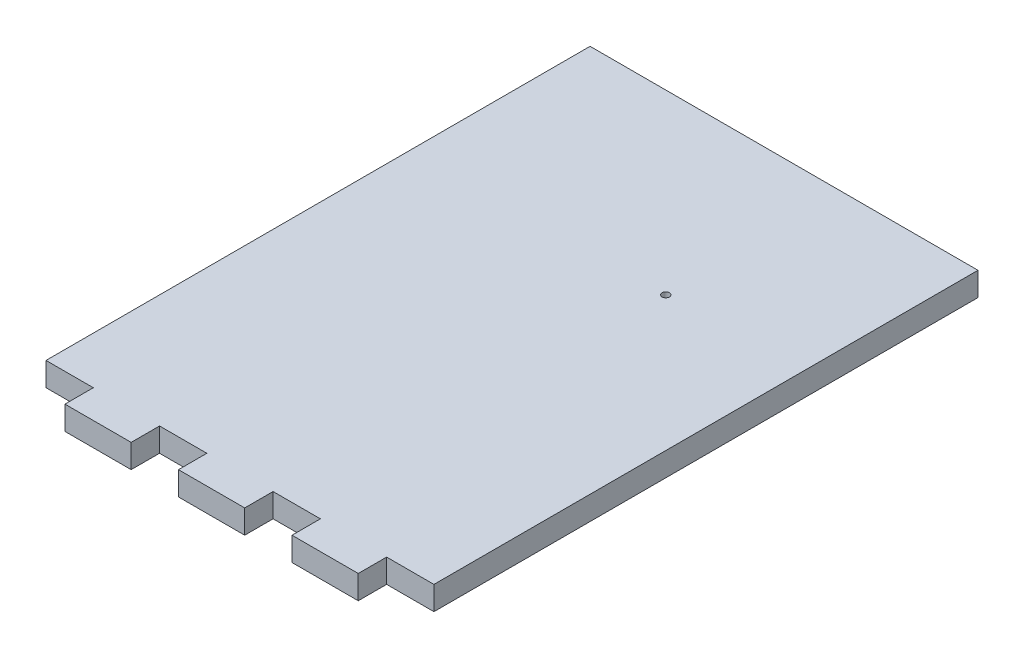
ISO-10303-21;
HEADER;
FILE_DESCRIPTION(('STEP AP214'),'2;1');
FILE_NAME('part.step','',(''),(''),'','','');
FILE_SCHEMA(('AUTOMOTIVE_DESIGN { 1 0 10303 214 1 1 1 1 }'));
ENDSEC;
DATA;
#1=APPLICATION_CONTEXT('core data for automotive mechanical design processes');
#2=APPLICATION_PROTOCOL_DEFINITION('international standard','automotive_design',2000,#1);
#3=PRODUCT_CONTEXT('',#1,'mechanical');
#4=PRODUCT('Part','Part','',(#3));
#5=PRODUCT_RELATED_PRODUCT_CATEGORY('part','',(#4));
#6=PRODUCT_DEFINITION_FORMATION('','',#4);
#7=PRODUCT_DEFINITION_CONTEXT('part definition',#1,'design');
#8=PRODUCT_DEFINITION('design','',#6,#7);
#9=PRODUCT_DEFINITION_SHAPE('','',#8);
#10=(LENGTH_UNIT() NAMED_UNIT(*) SI_UNIT(.MILLI.,.METRE.));
#11=(NAMED_UNIT(*) PLANE_ANGLE_UNIT() SI_UNIT($,.RADIAN.));
#12=(NAMED_UNIT(*) SI_UNIT($,.STERADIAN.) SOLID_ANGLE_UNIT());
#13=UNCERTAINTY_MEASURE_WITH_UNIT(LENGTH_MEASURE(1.E-05),#10,'distance_accuracy_value','');
#14=(GEOMETRIC_REPRESENTATION_CONTEXT(3) GLOBAL_UNCERTAINTY_ASSIGNED_CONTEXT((#13)) GLOBAL_UNIT_ASSIGNED_CONTEXT((#10,
#11,#12)) REPRESENTATION_CONTEXT('',''));
#15=CARTESIAN_POINT('',(0.,0.,0.));
#16=DIRECTION('',(0.,0.,1.));
#17=DIRECTION('',(1.,0.,0.));
#18=AXIS2_PLACEMENT_3D('',#15,#16,#17);
#19=CARTESIAN_POINT('',(0.,0.,0.));
#20=DIRECTION('',(0.,1.,0.));
#21=DIRECTION('',(0.,0.,1.));
#22=AXIS2_PLACEMENT_3D('',#19,#20,#21);
#23=PLANE('',#22);
#24=CARTESIAN_POINT('',(102.,0.,-190.));
#25=DIRECTION('',(0.,1.,0.));
#26=DIRECTION('',(0.,0.,1.));
#27=AXIS2_PLACEMENT_3D('',#24,#25,#26);
#28=CIRCLE('',#27,3.89999999999998);
#29=CARTESIAN_POINT('',(102.,0.,-186.1));
#30=VERTEX_POINT('',#29);
#31=EDGE_CURVE('E347',#30,#30,#28,.T.);
#32=ORIENTED_EDGE('',*,*,#31,.T.);
#33=EDGE_LOOP('',(#32));
#34=FACE_BOUND('',#33,.T.);
#35=DIRECTION('',(-1.,0.,0.));
#36=VECTOR('',#35,1.);
#37=CARTESIAN_POINT('',(164.,0.,-230.));
#38=LINE('',#37,#36);
#39=CARTESIAN_POINT('',(164.,0.,-230.));
#40=VERTEX_POINT('',#39);
#41=CARTESIAN_POINT('',(0.,0.,-230.));
#42=VERTEX_POINT('',#41);
#43=EDGE_CURVE('E181',#40,#42,#38,.T.);
#44=ORIENTED_EDGE('',*,*,#43,.F.);
#45=DIRECTION('',(0.,0.,1.));
#46=VECTOR('',#45,1.);
#47=CARTESIAN_POINT('',(164.,0.,-230.));
#48=LINE('',#47,#46);
#49=CARTESIAN_POINT('',(164.,0.,0.));
#50=VERTEX_POINT('',#49);
#51=EDGE_CURVE('E216',#40,#50,#48,.T.);
#52=ORIENTED_EDGE('',*,*,#51,.T.);
#53=DIRECTION('',(1.,0.,0.));
#54=VECTOR('',#53,1.);
#55=CARTESIAN_POINT('',(144.,0.,0.));
#56=LINE('',#55,#54);
#57=CARTESIAN_POINT('',(144.,0.,0.));
#58=VERTEX_POINT('',#57);
#59=EDGE_CURVE('E214',#58,#50,#56,.T.);
#60=ORIENTED_EDGE('',*,*,#59,.F.);
#61=DIRECTION('',(0.,0.,1.));
#62=VECTOR('',#61,1.);
#63=CARTESIAN_POINT('',(144.,0.,0.));
#64=LINE('',#63,#62);
#65=CARTESIAN_POINT('',(144.,0.,12.));
#66=VERTEX_POINT('',#65);
#67=EDGE_CURVE('E159',#58,#66,#64,.T.);
#68=ORIENTED_EDGE('',*,*,#67,.T.);
#69=DIRECTION('',(1.,0.,0.));
#70=VECTOR('',#69,1.);
#71=CARTESIAN_POINT('',(116.,0.,12.));
#72=LINE('',#71,#70);
#73=CARTESIAN_POINT('',(116.,0.,12.));
#74=VERTEX_POINT('',#73);
#75=EDGE_CURVE('E210',#74,#66,#72,.T.);
#76=ORIENTED_EDGE('',*,*,#75,.F.);
#77=DIRECTION('',(0.,0.,1.));
#78=VECTOR('',#77,1.);
#79=CARTESIAN_POINT('',(116.,0.,0.));
#80=LINE('',#79,#78);
#81=CARTESIAN_POINT('',(116.,0.,0.));
#82=VERTEX_POINT('',#81);
#83=EDGE_CURVE('E208',#82,#74,#80,.T.);
#84=ORIENTED_EDGE('',*,*,#83,.F.);
#85=DIRECTION('',(1.,0.,0.));
#86=VECTOR('',#85,1.);
#87=CARTESIAN_POINT('',(96.,0.,0.));
#88=LINE('',#87,#86);
#89=CARTESIAN_POINT('',(96.,0.,0.));
#90=VERTEX_POINT('',#89);
#91=EDGE_CURVE('E206',#90,#82,#88,.T.);
#92=ORIENTED_EDGE('',*,*,#91,.F.);
#93=DIRECTION('',(0.,0.,1.));
#94=VECTOR('',#93,1.);
#95=CARTESIAN_POINT('',(96.,0.,0.));
#96=LINE('',#95,#94);
#97=CARTESIAN_POINT('',(96.,0.,12.));
#98=VERTEX_POINT('',#97);
#99=EDGE_CURVE('E203',#90,#98,#96,.T.);
#100=ORIENTED_EDGE('',*,*,#99,.T.);
#101=DIRECTION('',(1.,0.,0.));
#102=VECTOR('',#101,1.);
#103=CARTESIAN_POINT('',(68.,0.,12.));
#104=LINE('',#103,#102);
#105=CARTESIAN_POINT('',(68.,0.,12.));
#106=VERTEX_POINT('',#105);
#107=EDGE_CURVE('E200',#106,#98,#104,.T.);
#108=ORIENTED_EDGE('',*,*,#107,.F.);
#109=DIRECTION('',(0.,0.,1.));
#110=VECTOR('',#109,1.);
#111=CARTESIAN_POINT('',(68.,0.,0.));
#112=LINE('',#111,#110);
#113=CARTESIAN_POINT('',(68.,0.,0.));
#114=VERTEX_POINT('',#113);
#115=EDGE_CURVE('E198',#114,#106,#112,.T.);
#116=ORIENTED_EDGE('',*,*,#115,.F.);
#117=DIRECTION('',(1.,0.,0.));
#118=VECTOR('',#117,1.);
#119=CARTESIAN_POINT('',(48.,0.,0.));
#120=LINE('',#119,#118);
#121=CARTESIAN_POINT('',(48.,0.,0.));
#122=VERTEX_POINT('',#121);
#123=EDGE_CURVE('E196',#122,#114,#120,.T.);
#124=ORIENTED_EDGE('',*,*,#123,.F.);
#125=DIRECTION('',(0.,0.,1.));
#126=VECTOR('',#125,1.);
#127=CARTESIAN_POINT('',(48.,0.,0.));
#128=LINE('',#127,#126);
#129=CARTESIAN_POINT('',(48.,0.,12.));
#130=VERTEX_POINT('',#129);
#131=EDGE_CURVE('E193',#122,#130,#128,.T.);
#132=ORIENTED_EDGE('',*,*,#131,.T.);
#133=DIRECTION('',(1.,0.,0.));
#134=VECTOR('',#133,1.);
#135=CARTESIAN_POINT('',(20.,0.,12.));
#136=LINE('',#135,#134);
#137=CARTESIAN_POINT('',(20.,0.,12.));
#138=VERTEX_POINT('',#137);
#139=EDGE_CURVE('E190',#138,#130,#136,.T.);
#140=ORIENTED_EDGE('',*,*,#139,.F.);
#141=DIRECTION('',(0.,0.,1.));
#142=VECTOR('',#141,1.);
#143=CARTESIAN_POINT('',(20.,0.,0.));
#144=LINE('',#143,#142);
#145=CARTESIAN_POINT('',(20.,0.,0.));
#146=VERTEX_POINT('',#145);
#147=EDGE_CURVE('E188',#146,#138,#144,.T.);
#148=ORIENTED_EDGE('',*,*,#147,.F.);
#149=DIRECTION('',(1.,0.,0.));
#150=VECTOR('',#149,1.);
#151=CARTESIAN_POINT('',(0.,0.,0.));
#152=LINE('',#151,#150);
#153=CARTESIAN_POINT('',(0.,0.,0.));
#154=VERTEX_POINT('',#153);
#155=EDGE_CURVE('E186',#154,#146,#152,.T.);
#156=ORIENTED_EDGE('',*,*,#155,.F.);
#157=DIRECTION('',(0.,0.,1.));
#158=VECTOR('',#157,1.);
#159=CARTESIAN_POINT('',(0.,0.,-230.));
#160=LINE('',#159,#158);
#161=EDGE_CURVE('E183',#42,#154,#160,.T.);
#162=ORIENTED_EDGE('',*,*,#161,.F.);
#163=EDGE_LOOP('',(#44,#52,#60,#68,#76,#84,#92,#100,#108,#116,#124,#132,#140,#148,#156,#162));
#164=FACE_BOUND('',#163,.T.);
#165=CARTESIAN_POINT('',(62.,0.,-190.));
#166=DIRECTION('',(0.,1.,0.));
#167=DIRECTION('',(0.,0.,1.));
#168=AXIS2_PLACEMENT_3D('',#165,#166,#167);
#169=CIRCLE('',#168,3.89999999999997);
#170=CARTESIAN_POINT('',(62.,0.,-186.1));
#171=VERTEX_POINT('',#170);
#172=EDGE_CURVE('E349',#171,#171,#169,.T.);
#173=ORIENTED_EDGE('',*,*,#172,.T.);
#174=EDGE_LOOP('',(#173));
#175=FACE_BOUND('',#174,.T.);
#176=CARTESIAN_POINT('',(107.,0.,-155.));
#177=DIRECTION('',(0.,1.,0.));
#178=DIRECTION('',(0.,0.,1.));
#179=AXIS2_PLACEMENT_3D('',#176,#177,#178);
#180=CIRCLE('',#179,1.54999999999999);
#181=CARTESIAN_POINT('',(107.,0.,-153.45));
#182=VERTEX_POINT('',#181);
#183=EDGE_CURVE('E341',#182,#182,#180,.T.);
#184=ORIENTED_EDGE('',*,*,#183,.T.);
#185=EDGE_LOOP('',(#184));
#186=FACE_BOUND('',#185,.T.);
#187=ADVANCED_FACE('F33',(#34,#164,#175,#186),#23,.F.);
#188=CARTESIAN_POINT('',(0.,10.,0.));
#189=DIRECTION('',(0.,1.,0.));
#190=DIRECTION('',(0.,0.,1.));
#191=AXIS2_PLACEMENT_3D('',#188,#189,#190);
#192=PLANE('',#191);
#193=DIRECTION('',(-1.,0.,0.));
#194=VECTOR('',#193,1.);
#195=CARTESIAN_POINT('',(164.,10.,-230.));
#196=LINE('',#195,#194);
#197=CARTESIAN_POINT('',(164.,10.,-230.));
#198=VERTEX_POINT('',#197);
#199=CARTESIAN_POINT('',(0.,10.,-230.));
#200=VERTEX_POINT('',#199);
#201=EDGE_CURVE('E219',#198,#200,#196,.T.);
#202=ORIENTED_EDGE('',*,*,#201,.T.);
#203=DIRECTION('',(0.,0.,1.));
#204=VECTOR('',#203,1.);
#205=CARTESIAN_POINT('',(0.,10.,-230.));
#206=LINE('',#205,#204);
#207=CARTESIAN_POINT('',(0.,10.,0.));
#208=VERTEX_POINT('',#207);
#209=EDGE_CURVE('E113',#200,#208,#206,.T.);
#210=ORIENTED_EDGE('',*,*,#209,.T.);
#211=DIRECTION('',(1.,0.,0.));
#212=VECTOR('',#211,1.);
#213=CARTESIAN_POINT('',(0.,10.,0.));
#214=LINE('',#213,#212);
#215=CARTESIAN_POINT('',(20.,10.,0.));
#216=VERTEX_POINT('',#215);
#217=EDGE_CURVE('E254',#208,#216,#214,.T.);
#218=ORIENTED_EDGE('',*,*,#217,.T.);
#219=DIRECTION('',(0.,0.,1.));
#220=VECTOR('',#219,1.);
#221=CARTESIAN_POINT('',(20.,10.,0.));
#222=LINE('',#221,#220);
#223=CARTESIAN_POINT('',(20.,10.,12.));
#224=VERTEX_POINT('',#223);
#225=EDGE_CURVE('E271',#216,#224,#222,.T.);
#226=ORIENTED_EDGE('',*,*,#225,.T.);
#227=DIRECTION('',(1.,0.,0.));
#228=VECTOR('',#227,1.);
#229=CARTESIAN_POINT('',(20.,10.,12.));
#230=LINE('',#229,#228);
#231=CARTESIAN_POINT('',(48.,10.,12.));
#232=VERTEX_POINT('',#231);
#233=EDGE_CURVE('E267',#224,#232,#230,.T.);
#234=ORIENTED_EDGE('',*,*,#233,.T.);
#235=DIRECTION('',(0.,0.,1.));
#236=VECTOR('',#235,1.);
#237=CARTESIAN_POINT('',(48.,10.,0.));
#238=LINE('',#237,#236);
#239=CARTESIAN_POINT('',(48.,10.,0.));
#240=VERTEX_POINT('',#239);
#241=EDGE_CURVE('E270',#240,#232,#238,.T.);
#242=ORIENTED_EDGE('',*,*,#241,.F.);
#243=DIRECTION('',(1.,0.,0.));
#244=VECTOR('',#243,1.);
#245=CARTESIAN_POINT('',(48.,10.,0.));
#246=LINE('',#245,#244);
#247=CARTESIAN_POINT('',(68.,10.,0.));
#248=VERTEX_POINT('',#247);
#249=EDGE_CURVE('E273',#240,#248,#246,.T.);
#250=ORIENTED_EDGE('',*,*,#249,.T.);
#251=DIRECTION('',(0.,0.,1.));
#252=VECTOR('',#251,1.);
#253=CARTESIAN_POINT('',(68.,10.,0.));
#254=LINE('',#253,#252);
#255=CARTESIAN_POINT('',(68.,10.,12.));
#256=VERTEX_POINT('',#255);
#257=EDGE_CURVE('E279',#248,#256,#254,.T.);
#258=ORIENTED_EDGE('',*,*,#257,.T.);
#259=DIRECTION('',(1.,0.,0.));
#260=VECTOR('',#259,1.);
#261=CARTESIAN_POINT('',(68.,10.,12.));
#262=LINE('',#261,#260);
#263=CARTESIAN_POINT('',(96.,10.,12.));
#264=VERTEX_POINT('',#263);
#265=EDGE_CURVE('E281',#256,#264,#262,.T.);
#266=ORIENTED_EDGE('',*,*,#265,.T.);
#267=DIRECTION('',(0.,0.,1.));
#268=VECTOR('',#267,1.);
#269=CARTESIAN_POINT('',(96.,10.,0.));
#270=LINE('',#269,#268);
#271=CARTESIAN_POINT('',(96.,10.,0.));
#272=VERTEX_POINT('',#271);
#273=EDGE_CURVE('E283',#272,#264,#270,.T.);
#274=ORIENTED_EDGE('',*,*,#273,.F.);
#275=DIRECTION('',(1.,0.,0.));
#276=VECTOR('',#275,1.);
#277=CARTESIAN_POINT('',(96.,10.,0.));
#278=LINE('',#277,#276);
#279=CARTESIAN_POINT('',(116.,10.,0.));
#280=VERTEX_POINT('',#279);
#281=EDGE_CURVE('E286',#272,#280,#278,.T.);
#282=ORIENTED_EDGE('',*,*,#281,.T.);
#283=DIRECTION('',(0.,0.,1.));
#284=VECTOR('',#283,1.);
#285=CARTESIAN_POINT('',(116.,10.,0.));
#286=LINE('',#285,#284);
#287=CARTESIAN_POINT('',(116.,10.,12.));
#288=VERTEX_POINT('',#287);
#289=EDGE_CURVE('E176',#280,#288,#286,.T.);
#290=ORIENTED_EDGE('',*,*,#289,.T.);
#291=DIRECTION('',(1.,0.,0.));
#292=VECTOR('',#291,1.);
#293=CARTESIAN_POINT('',(116.,10.,12.));
#294=LINE('',#293,#292);
#295=CARTESIAN_POINT('',(144.,10.,12.));
#296=VERTEX_POINT('',#295);
#297=EDGE_CURVE('E173',#288,#296,#294,.T.);
#298=ORIENTED_EDGE('',*,*,#297,.T.);
#299=DIRECTION('',(0.,0.,1.));
#300=VECTOR('',#299,1.);
#301=CARTESIAN_POINT('',(144.,10.,0.));
#302=LINE('',#301,#300);
#303=CARTESIAN_POINT('',(144.,10.,0.));
#304=VERTEX_POINT('',#303);
#305=EDGE_CURVE('E157',#304,#296,#302,.T.);
#306=ORIENTED_EDGE('',*,*,#305,.F.);
#307=DIRECTION('',(1.,0.,0.));
#308=VECTOR('',#307,1.);
#309=CARTESIAN_POINT('',(144.,10.,0.));
#310=LINE('',#309,#308);
#311=CARTESIAN_POINT('',(164.,10.,0.));
#312=VERTEX_POINT('',#311);
#313=EDGE_CURVE('E164',#304,#312,#310,.T.);
#314=ORIENTED_EDGE('',*,*,#313,.T.);
#315=DIRECTION('',(0.,0.,1.));
#316=VECTOR('',#315,1.);
#317=CARTESIAN_POINT('',(164.,10.,-230.));
#318=LINE('',#317,#316);
#319=EDGE_CURVE('E168',#198,#312,#318,.T.);
#320=ORIENTED_EDGE('',*,*,#319,.F.);
#321=EDGE_LOOP('',(#202,#210,#218,#226,#234,#242,#250,#258,#266,#274,#282,#290,#298,#306,#314,#320));
#322=FACE_BOUND('',#321,.T.);
#323=CARTESIAN_POINT('',(107.,10.,-155.));
#324=DIRECTION('',(0.,1.,0.));
#325=DIRECTION('',(0.,0.,1.));
#326=AXIS2_PLACEMENT_3D('',#323,#324,#325);
#327=CIRCLE('',#326,1.54999999999999);
#328=CARTESIAN_POINT('',(107.,10.,-153.45));
#329=VERTEX_POINT('',#328);
#330=EDGE_CURVE('E338',#329,#329,#327,.T.);
#331=ORIENTED_EDGE('',*,*,#330,.F.);
#332=EDGE_LOOP('',(#331));
#333=FACE_BOUND('',#332,.T.);
#334=ADVANCED_FACE('F170',(#322,#333),#192,.T.);
#335=CARTESIAN_POINT('',(164.,10.,-230.));
#336=DIRECTION('',(0.,0.,1.));
#337=DIRECTION('',(1.,0.,0.));
#338=AXIS2_PLACEMENT_3D('',#335,#336,#337);
#339=PLANE('',#338);
#340=ORIENTED_EDGE('',*,*,#43,.T.);
#341=DIRECTION('',(0.,-1.,0.));
#342=VECTOR('',#341,1.);
#343=CARTESIAN_POINT('',(0.,10.,-230.));
#344=LINE('',#343,#342);
#345=EDGE_CURVE('E11',#200,#42,#344,.T.);
#346=ORIENTED_EDGE('',*,*,#345,.F.);
#347=ORIENTED_EDGE('',*,*,#201,.F.);
#348=DIRECTION('',(0.,-1.,0.));
#349=VECTOR('',#348,1.);
#350=CARTESIAN_POINT('',(164.,10.,-230.));
#351=LINE('',#350,#349);
#352=EDGE_CURVE('E50',#198,#40,#351,.T.);
#353=ORIENTED_EDGE('',*,*,#352,.T.);
#354=EDGE_LOOP('',(#340,#346,#347,#353));
#355=FACE_BOUND('',#354,.T.);
#356=ADVANCED_FACE('F35',(#355),#339,.F.);
#357=CARTESIAN_POINT('',(0.,10.,-230.));
#358=DIRECTION('',(1.,0.,0.));
#359=DIRECTION('',(0.,0.,-1.));
#360=AXIS2_PLACEMENT_3D('',#357,#358,#359);
#361=PLANE('',#360);
#362=ORIENTED_EDGE('',*,*,#161,.T.);
#363=DIRECTION('',(0.,-1.,0.));
#364=VECTOR('',#363,1.);
#365=CARTESIAN_POINT('',(0.,10.,0.));
#366=LINE('',#365,#364);
#367=EDGE_CURVE('E42',#208,#154,#366,.T.);
#368=ORIENTED_EDGE('',*,*,#367,.F.);
#369=ORIENTED_EDGE('',*,*,#209,.F.);
#370=ORIENTED_EDGE('',*,*,#345,.T.);
#371=EDGE_LOOP('',(#362,#368,#369,#370));
#372=FACE_BOUND('',#371,.T.);
#373=ADVANCED_FACE('F358',(#372),#361,.F.);
#374=CARTESIAN_POINT('',(0.,10.,0.));
#375=DIRECTION('',(0.,0.,-1.));
#376=DIRECTION('',(-1.,0.,0.));
#377=AXIS2_PLACEMENT_3D('',#374,#375,#376);
#378=PLANE('',#377);
#379=ORIENTED_EDGE('',*,*,#155,.T.);
#380=DIRECTION('',(0.,-1.,0.));
#381=VECTOR('',#380,1.);
#382=CARTESIAN_POINT('',(20.,10.,0.));
#383=LINE('',#382,#381);
#384=EDGE_CURVE('E246',#216,#146,#383,.T.);
#385=ORIENTED_EDGE('',*,*,#384,.F.);
#386=ORIENTED_EDGE('',*,*,#217,.F.);
#387=ORIENTED_EDGE('',*,*,#367,.T.);
#388=EDGE_LOOP('',(#379,#385,#386,#387));
#389=FACE_BOUND('',#388,.T.);
#390=ADVANCED_FACE('F252',(#389),#378,.F.);
#391=CARTESIAN_POINT('',(20.,10.,0.));
#392=DIRECTION('',(1.,0.,0.));
#393=DIRECTION('',(0.,0.,-1.));
#394=AXIS2_PLACEMENT_3D('',#391,#392,#393);
#395=PLANE('',#394);
#396=ORIENTED_EDGE('',*,*,#147,.T.);
#397=DIRECTION('',(0.,-1.,0.));
#398=VECTOR('',#397,1.);
#399=CARTESIAN_POINT('',(20.,10.,12.));
#400=LINE('',#399,#398);
#401=EDGE_CURVE('E243',#224,#138,#400,.T.);
#402=ORIENTED_EDGE('',*,*,#401,.F.);
#403=ORIENTED_EDGE('',*,*,#225,.F.);
#404=ORIENTED_EDGE('',*,*,#384,.T.);
#405=EDGE_LOOP('',(#396,#402,#403,#404));
#406=FACE_BOUND('',#405,.T.);
#407=ADVANCED_FACE('F261',(#406),#395,.F.);
#408=CARTESIAN_POINT('',(20.,10.,12.));
#409=DIRECTION('',(0.,0.,-1.));
#410=DIRECTION('',(-1.,0.,0.));
#411=AXIS2_PLACEMENT_3D('',#408,#409,#410);
#412=PLANE('',#411);
#413=ORIENTED_EDGE('',*,*,#139,.T.);
#414=DIRECTION('',(0.,-1.,0.));
#415=VECTOR('',#414,1.);
#416=CARTESIAN_POINT('',(48.,10.,12.));
#417=LINE('',#416,#415);
#418=EDGE_CURVE('E241',#232,#130,#417,.T.);
#419=ORIENTED_EDGE('',*,*,#418,.F.);
#420=ORIENTED_EDGE('',*,*,#233,.F.);
#421=ORIENTED_EDGE('',*,*,#401,.T.);
#422=EDGE_LOOP('',(#413,#419,#420,#421));
#423=FACE_BOUND('',#422,.T.);
#424=ADVANCED_FACE('F265',(#423),#412,.F.);
#425=CARTESIAN_POINT('',(48.,10.,0.));
#426=DIRECTION('',(1.,0.,0.));
#427=DIRECTION('',(0.,0.,-1.));
#428=AXIS2_PLACEMENT_3D('',#425,#426,#427);
#429=PLANE('',#428);
#430=ORIENTED_EDGE('',*,*,#131,.F.);
#431=DIRECTION('',(0.,-1.,0.));
#432=VECTOR('',#431,1.);
#433=CARTESIAN_POINT('',(48.,10.,0.));
#434=LINE('',#433,#432);
#435=EDGE_CURVE('E239',#240,#122,#434,.T.);
#436=ORIENTED_EDGE('',*,*,#435,.F.);
#437=ORIENTED_EDGE('',*,*,#241,.T.);
#438=ORIENTED_EDGE('',*,*,#418,.T.);
#439=EDGE_LOOP('',(#430,#436,#437,#438));
#440=FACE_BOUND('',#439,.T.);
#441=ADVANCED_FACE('F370',(#440),#429,.T.);
#442=CARTESIAN_POINT('',(48.,10.,0.));
#443=DIRECTION('',(0.,0.,-1.));
#444=DIRECTION('',(-1.,0.,0.));
#445=AXIS2_PLACEMENT_3D('',#442,#443,#444);
#446=PLANE('',#445);
#447=ORIENTED_EDGE('',*,*,#123,.T.);
#448=DIRECTION('',(0.,-1.,0.));
#449=VECTOR('',#448,1.);
#450=CARTESIAN_POINT('',(68.,10.,0.));
#451=LINE('',#450,#449);
#452=EDGE_CURVE('E236',#248,#114,#451,.T.);
#453=ORIENTED_EDGE('',*,*,#452,.F.);
#454=ORIENTED_EDGE('',*,*,#249,.F.);
#455=ORIENTED_EDGE('',*,*,#435,.T.);
#456=EDGE_LOOP('',(#447,#453,#454,#455));
#457=FACE_BOUND('',#456,.T.);
#458=ADVANCED_FACE('F373',(#457),#446,.F.);
#459=CARTESIAN_POINT('',(68.,10.,0.));
#460=DIRECTION('',(1.,0.,0.));
#461=DIRECTION('',(0.,0.,-1.));
#462=AXIS2_PLACEMENT_3D('',#459,#460,#461);
#463=PLANE('',#462);
#464=ORIENTED_EDGE('',*,*,#115,.T.);
#465=DIRECTION('',(0.,-1.,0.));
#466=VECTOR('',#465,1.);
#467=CARTESIAN_POINT('',(68.,10.,12.));
#468=LINE('',#467,#466);
#469=EDGE_CURVE('E233',#256,#106,#468,.T.);
#470=ORIENTED_EDGE('',*,*,#469,.F.);
#471=ORIENTED_EDGE('',*,*,#257,.F.);
#472=ORIENTED_EDGE('',*,*,#452,.T.);
#473=EDGE_LOOP('',(#464,#470,#471,#472));
#474=FACE_BOUND('',#473,.T.);
#475=ADVANCED_FACE('F377',(#474),#463,.F.);
#476=CARTESIAN_POINT('',(68.,10.,12.));
#477=DIRECTION('',(0.,0.,-1.));
#478=DIRECTION('',(-1.,0.,0.));
#479=AXIS2_PLACEMENT_3D('',#476,#477,#478);
#480=PLANE('',#479);
#481=ORIENTED_EDGE('',*,*,#107,.T.);
#482=DIRECTION('',(0.,-1.,0.));
#483=VECTOR('',#482,1.);
#484=CARTESIAN_POINT('',(96.,10.,12.));
#485=LINE('',#484,#483);
#486=EDGE_CURVE('E231',#264,#98,#485,.T.);
#487=ORIENTED_EDGE('',*,*,#486,.F.);
#488=ORIENTED_EDGE('',*,*,#265,.F.);
#489=ORIENTED_EDGE('',*,*,#469,.T.);
#490=EDGE_LOOP('',(#481,#487,#488,#489));
#491=FACE_BOUND('',#490,.T.);
#492=ADVANCED_FACE('F381',(#491),#480,.F.);
#493=CARTESIAN_POINT('',(96.,10.,0.));
#494=DIRECTION('',(1.,0.,0.));
#495=DIRECTION('',(0.,0.,-1.));
#496=AXIS2_PLACEMENT_3D('',#493,#494,#495);
#497=PLANE('',#496);
#498=ORIENTED_EDGE('',*,*,#99,.F.);
#499=DIRECTION('',(0.,-1.,0.));
#500=VECTOR('',#499,1.);
#501=CARTESIAN_POINT('',(96.,10.,0.));
#502=LINE('',#501,#500);
#503=EDGE_CURVE('E229',#272,#90,#502,.T.);
#504=ORIENTED_EDGE('',*,*,#503,.F.);
#505=ORIENTED_EDGE('',*,*,#273,.T.);
#506=ORIENTED_EDGE('',*,*,#486,.T.);
#507=EDGE_LOOP('',(#498,#504,#505,#506));
#508=FACE_BOUND('',#507,.T.);
#509=ADVANCED_FACE('F385',(#508),#497,.T.);
#510=CARTESIAN_POINT('',(96.,10.,0.));
#511=DIRECTION('',(0.,0.,-1.));
#512=DIRECTION('',(-1.,0.,0.));
#513=AXIS2_PLACEMENT_3D('',#510,#511,#512);
#514=PLANE('',#513);
#515=ORIENTED_EDGE('',*,*,#91,.T.);
#516=DIRECTION('',(0.,-1.,0.));
#517=VECTOR('',#516,1.);
#518=CARTESIAN_POINT('',(116.,10.,0.));
#519=LINE('',#518,#517);
#520=EDGE_CURVE('E226',#280,#82,#519,.T.);
#521=ORIENTED_EDGE('',*,*,#520,.F.);
#522=ORIENTED_EDGE('',*,*,#281,.F.);
#523=ORIENTED_EDGE('',*,*,#503,.T.);
#524=EDGE_LOOP('',(#515,#521,#522,#523));
#525=FACE_BOUND('',#524,.T.);
#526=ADVANCED_FACE('F389',(#525),#514,.F.);
#527=CARTESIAN_POINT('',(116.,10.,0.));
#528=DIRECTION('',(1.,0.,0.));
#529=DIRECTION('',(0.,0.,-1.));
#530=AXIS2_PLACEMENT_3D('',#527,#528,#529);
#531=PLANE('',#530);
#532=ORIENTED_EDGE('',*,*,#83,.T.);
#533=DIRECTION('',(0.,-1.,0.));
#534=VECTOR('',#533,1.);
#535=CARTESIAN_POINT('',(116.,10.,12.));
#536=LINE('',#535,#534);
#537=EDGE_CURVE('E223',#288,#74,#536,.T.);
#538=ORIENTED_EDGE('',*,*,#537,.F.);
#539=ORIENTED_EDGE('',*,*,#289,.F.);
#540=ORIENTED_EDGE('',*,*,#520,.T.);
#541=EDGE_LOOP('',(#532,#538,#539,#540));
#542=FACE_BOUND('',#541,.T.);
#543=ADVANCED_FACE('F293',(#542),#531,.F.);
#544=CARTESIAN_POINT('',(116.,10.,12.));
#545=DIRECTION('',(0.,0.,-1.));
#546=DIRECTION('',(-1.,0.,0.));
#547=AXIS2_PLACEMENT_3D('',#544,#545,#546);
#548=PLANE('',#547);
#549=ORIENTED_EDGE('',*,*,#75,.T.);
#550=DIRECTION('',(0.,-1.,0.));
#551=VECTOR('',#550,1.);
#552=CARTESIAN_POINT('',(144.,10.,12.));
#553=LINE('',#552,#551);
#554=EDGE_CURVE('E162',#296,#66,#553,.T.);
#555=ORIENTED_EDGE('',*,*,#554,.F.);
#556=ORIENTED_EDGE('',*,*,#297,.F.);
#557=ORIENTED_EDGE('',*,*,#537,.T.);
#558=EDGE_LOOP('',(#549,#555,#556,#557));
#559=FACE_BOUND('',#558,.T.);
#560=ADVANCED_FACE('F297',(#559),#548,.F.);
#561=CARTESIAN_POINT('',(144.,10.,0.));
#562=DIRECTION('',(1.,0.,0.));
#563=DIRECTION('',(0.,0.,-1.));
#564=AXIS2_PLACEMENT_3D('',#561,#562,#563);
#565=PLANE('',#564);
#566=ORIENTED_EDGE('',*,*,#67,.F.);
#567=DIRECTION('',(0.,-1.,0.));
#568=VECTOR('',#567,1.);
#569=CARTESIAN_POINT('',(144.,10.,0.));
#570=LINE('',#569,#568);
#571=EDGE_CURVE('E153',#304,#58,#570,.T.);
#572=ORIENTED_EDGE('',*,*,#571,.F.);
#573=ORIENTED_EDGE('',*,*,#305,.T.);
#574=ORIENTED_EDGE('',*,*,#554,.T.);
#575=EDGE_LOOP('',(#566,#572,#573,#574));
#576=FACE_BOUND('',#575,.T.);
#577=ADVANCED_FACE('F155',(#576),#565,.T.);
#578=CARTESIAN_POINT('',(144.,10.,0.));
#579=DIRECTION('',(0.,0.,-1.));
#580=DIRECTION('',(-1.,0.,0.));
#581=AXIS2_PLACEMENT_3D('',#578,#579,#580);
#582=PLANE('',#581);
#583=ORIENTED_EDGE('',*,*,#59,.T.);
#584=DIRECTION('',(0.,-1.,0.));
#585=VECTOR('',#584,1.);
#586=CARTESIAN_POINT('',(164.,10.,0.));
#587=LINE('',#586,#585);
#588=EDGE_CURVE('E101',#312,#50,#587,.T.);
#589=ORIENTED_EDGE('',*,*,#588,.F.);
#590=ORIENTED_EDGE('',*,*,#313,.F.);
#591=ORIENTED_EDGE('',*,*,#571,.T.);
#592=EDGE_LOOP('',(#583,#589,#590,#591));
#593=FACE_BOUND('',#592,.T.);
#594=ADVANCED_FACE('F165',(#593),#582,.F.);
#595=CARTESIAN_POINT('',(164.,10.,-230.));
#596=DIRECTION('',(1.,0.,0.));
#597=DIRECTION('',(0.,0.,-1.));
#598=AXIS2_PLACEMENT_3D('',#595,#596,#597);
#599=PLANE('',#598);
#600=ORIENTED_EDGE('',*,*,#51,.F.);
#601=ORIENTED_EDGE('',*,*,#352,.F.);
#602=ORIENTED_EDGE('',*,*,#319,.T.);
#603=ORIENTED_EDGE('',*,*,#588,.T.);
#604=EDGE_LOOP('',(#600,#601,#602,#603));
#605=FACE_BOUND('',#604,.T.);
#606=ADVANCED_FACE('F298',(#605),#599,.T.);
#607=CARTESIAN_POINT('',(62.,6.,-190.));
#608=DIRECTION('',(0.,-1.,0.));
#609=DIRECTION('',(0.,0.,-1.));
#610=AXIS2_PLACEMENT_3D('',#607,#608,#609);
#611=CYLINDRICAL_SURFACE('',#610,3.89999999999997);
#612=CARTESIAN_POINT('',(62.,6.,-190.));
#613=DIRECTION('',(0.,1.,0.));
#614=DIRECTION('',(0.,0.,1.));
#615=AXIS2_PLACEMENT_3D('',#612,#613,#614);
#616=CIRCLE('',#615,3.89999999999997);
#617=CARTESIAN_POINT('',(62.,6.,-186.1));
#618=VERTEX_POINT('',#617);
#619=EDGE_CURVE('E184',#618,#618,#616,.T.);
#620=ORIENTED_EDGE('',*,*,#619,.T.);
#621=EDGE_LOOP('',(#620));
#622=FACE_BOUND('',#621,.T.);
#623=ORIENTED_EDGE('',*,*,#172,.F.);
#624=EDGE_LOOP('',(#623));
#625=FACE_BOUND('',#624,.T.);
#626=ADVANCED_FACE('F300',(#622,#625),#611,.F.);
#627=CARTESIAN_POINT('',(62.,6.,-190.));
#628=DIRECTION('',(0.,1.,0.));
#629=DIRECTION('',(0.,0.,1.));
#630=AXIS2_PLACEMENT_3D('',#627,#628,#629);
#631=PLANE('',#630);
#632=ORIENTED_EDGE('',*,*,#619,.F.);
#633=EDGE_LOOP('',(#632));
#634=FACE_BOUND('',#633,.T.);
#635=ADVANCED_FACE('F306',(#634),#631,.F.);
#636=CARTESIAN_POINT('',(102.,6.,-190.));
#637=DIRECTION('',(0.,-1.,0.));
#638=DIRECTION('',(0.,0.,-1.));
#639=AXIS2_PLACEMENT_3D('',#636,#637,#638);
#640=CYLINDRICAL_SURFACE('',#639,3.89999999999998);
#641=CARTESIAN_POINT('',(102.,6.,-190.));
#642=DIRECTION('',(0.,1.,0.));
#643=DIRECTION('',(0.,0.,1.));
#644=AXIS2_PLACEMENT_3D('',#641,#642,#643);
#645=CIRCLE('',#644,3.89999999999998);
#646=CARTESIAN_POINT('',(102.,6.,-186.1));
#647=VERTEX_POINT('',#646);
#648=EDGE_CURVE('E344',#647,#647,#645,.T.);
#649=ORIENTED_EDGE('',*,*,#648,.T.);
#650=EDGE_LOOP('',(#649));
#651=FACE_BOUND('',#650,.T.);
#652=ORIENTED_EDGE('',*,*,#31,.F.);
#653=EDGE_LOOP('',(#652));
#654=FACE_BOUND('',#653,.T.);
#655=ADVANCED_FACE('F321',(#651,#654),#640,.F.);
#656=CARTESIAN_POINT('',(102.,6.,-190.));
#657=DIRECTION('',(0.,1.,0.));
#658=DIRECTION('',(0.,0.,1.));
#659=AXIS2_PLACEMENT_3D('',#656,#657,#658);
#660=PLANE('',#659);
#661=ORIENTED_EDGE('',*,*,#648,.F.);
#662=EDGE_LOOP('',(#661));
#663=FACE_BOUND('',#662,.T.);
#664=ADVANCED_FACE('F323',(#663),#660,.F.);
#665=CARTESIAN_POINT('',(107.,10.,-155.));
#666=DIRECTION('',(0.,-1.,0.));
#667=DIRECTION('',(0.,0.,-1.));
#668=AXIS2_PLACEMENT_3D('',#665,#666,#667);
#669=CYLINDRICAL_SURFACE('',#668,1.54999999999999);
#670=ORIENTED_EDGE('',*,*,#330,.T.);
#671=EDGE_LOOP('',(#670));
#672=FACE_BOUND('',#671,.T.);
#673=ORIENTED_EDGE('',*,*,#183,.F.);
#674=EDGE_LOOP('',(#673));
#675=FACE_BOUND('',#674,.T.);
#676=ADVANCED_FACE('F326',(#672,#675),#669,.F.);
#677=CLOSED_SHELL('',(#187,#334,#356,#373,#390,#407,#424,#441,#458,#475,#492,#509,#526,#543,
#560,#577,#594,#606,#626,#635,#655,#664,#676));
#678=MANIFOLD_SOLID_BREP('B2',#677);
#679=ADVANCED_BREP_SHAPE_REPRESENTATION('',(#18,#678),#14);
#680=SHAPE_DEFINITION_REPRESENTATION(#9,#679);
ENDSEC;
END-ISO-10303-21;
